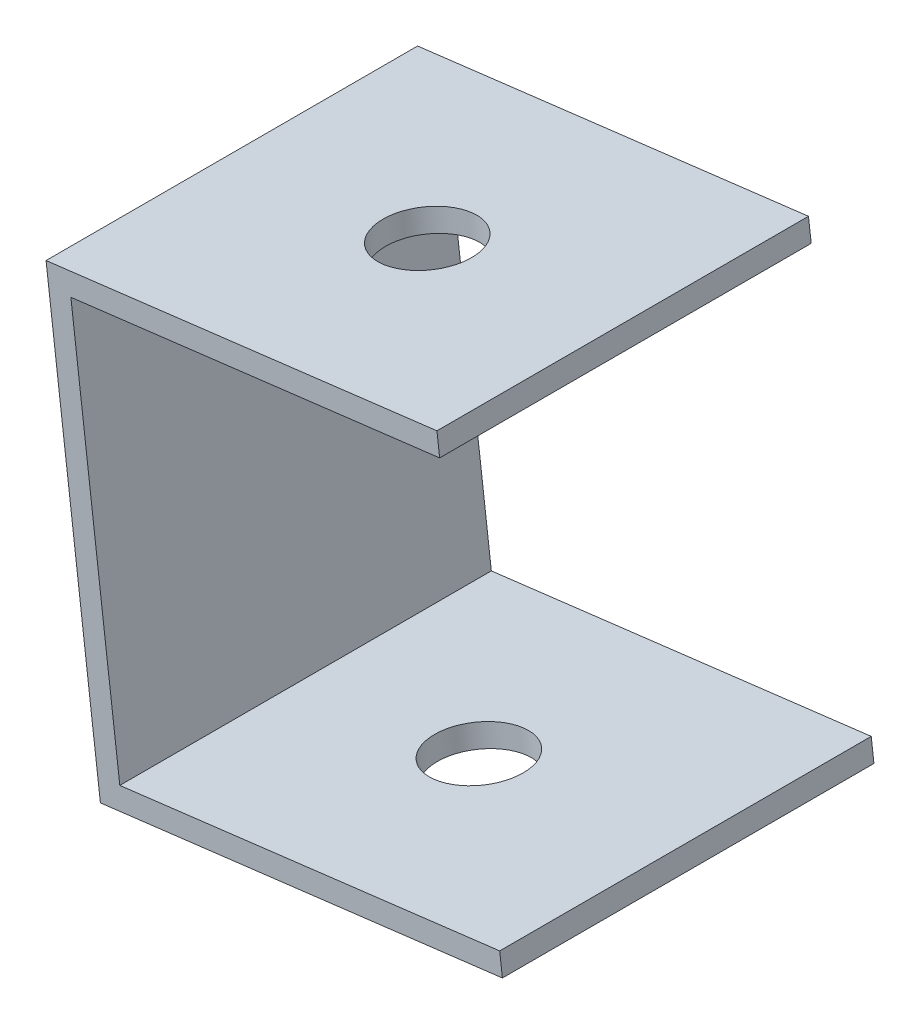
ISO-10303-21;
HEADER;
FILE_DESCRIPTION(('STEP AP214'),'2;1');
FILE_NAME('part.step','',(''),(''),'','','');
FILE_SCHEMA(('AUTOMOTIVE_DESIGN { 1 0 10303 214 1 1 1 1 }'));
ENDSEC;
DATA;
#1=APPLICATION_CONTEXT('core data for automotive mechanical design processes');
#2=APPLICATION_PROTOCOL_DEFINITION('international standard','automotive_design',2000,#1);
#3=PRODUCT_CONTEXT('',#1,'mechanical');
#4=PRODUCT('Part','Part','',(#3));
#5=PRODUCT_RELATED_PRODUCT_CATEGORY('part','',(#4));
#6=PRODUCT_DEFINITION_FORMATION('','',#4);
#7=PRODUCT_DEFINITION_CONTEXT('part definition',#1,'design');
#8=PRODUCT_DEFINITION('design','',#6,#7);
#9=PRODUCT_DEFINITION_SHAPE('','',#8);
#10=(LENGTH_UNIT() NAMED_UNIT(*) SI_UNIT(.MILLI.,.METRE.));
#11=(NAMED_UNIT(*) PLANE_ANGLE_UNIT() SI_UNIT($,.RADIAN.));
#12=(NAMED_UNIT(*) SI_UNIT($,.STERADIAN.) SOLID_ANGLE_UNIT());
#13=UNCERTAINTY_MEASURE_WITH_UNIT(LENGTH_MEASURE(1.E-05),#10,'distance_accuracy_value','');
#14=(GEOMETRIC_REPRESENTATION_CONTEXT(3) GLOBAL_UNCERTAINTY_ASSIGNED_CONTEXT((#13)) GLOBAL_UNIT_ASSIGNED_CONTEXT((#10,
#11,#12)) REPRESENTATION_CONTEXT('',''));
#15=CARTESIAN_POINT('',(0.,0.,0.));
#16=DIRECTION('',(0.,0.,1.));
#17=DIRECTION('',(1.,0.,0.));
#18=AXIS2_PLACEMENT_3D('',#15,#16,#17);
#19=CARTESIAN_POINT('',(54.1021961274049,6.64291439538608,50.));
#20=DIRECTION('',(-0.121869343405145,0.992546151641323,0.));
#21=DIRECTION('',(-0.992546151641323,-0.121869343405145,0.));
#22=AXIS2_PLACEMENT_3D('',#19,#20,#21);
#23=PLANE('',#22);
#24=CARTESIAN_POINT('',(26.3024730184951,3.22953760023633,25.));
#25=DIRECTION('',(-0.121869343405145,0.992546151641323,0.));
#26=DIRECTION('',(-0.992546151641323,-0.121869343405145,0.));
#27=AXIS2_PLACEMENT_3D('',#24,#25,#26);
#28=CIRCLE('',#27,6.00000000000001);
#29=CARTESIAN_POINT('',(20.3471961086471,2.49832153980547,25.));
#30=VERTEX_POINT('',#29);
#31=EDGE_CURVE('E220',#30,#30,#28,.F.);
#32=ORIENTED_EDGE('',*,*,#31,.F.);
#33=EDGE_LOOP('',(#32));
#34=FACE_BOUND('',#33,.T.);
#35=DIRECTION('',(0.992546151641322,0.121869343405145,0.));
#36=VECTOR('',#35,1.);
#37=CARTESIAN_POINT('',(54.1021961274049,6.64291439538608,0.));
#38=LINE('',#37,#36);
#39=CARTESIAN_POINT('',(0.,0.,0.));
#40=VERTEX_POINT('',#39);
#41=CARTESIAN_POINT('',(54.1021961274049,6.64291439538608,0.));
#42=VERTEX_POINT('',#41);
#43=EDGE_CURVE('E146',#40,#42,#38,.T.);
#44=ORIENTED_EDGE('',*,*,#43,.T.);
#45=DIRECTION('',(0.,0.,-1.));
#46=VECTOR('',#45,1.);
#47=CARTESIAN_POINT('',(54.1021961274049,6.64291439538608,50.));
#48=LINE('',#47,#46);
#49=CARTESIAN_POINT('',(54.1021961274049,6.64291439538608,50.));
#50=VERTEX_POINT('',#49);
#51=EDGE_CURVE('E11',#50,#42,#48,.T.);
#52=ORIENTED_EDGE('',*,*,#51,.F.);
#53=DIRECTION('',(0.992546151641322,0.121869343405145,0.));
#54=VECTOR('',#53,1.);
#55=CARTESIAN_POINT('',(54.1021961274049,6.64291439538608,50.));
#56=LINE('',#55,#54);
#57=CARTESIAN_POINT('',(0.,0.,50.));
#58=VERTEX_POINT('',#57);
#59=EDGE_CURVE('E169',#58,#50,#56,.T.);
#60=ORIENTED_EDGE('',*,*,#59,.F.);
#61=DIRECTION('',(0.,0.,-1.));
#62=VECTOR('',#61,1.);
#63=CARTESIAN_POINT('',(0.,0.,50.));
#64=LINE('',#63,#62);
#65=EDGE_CURVE('E142',#58,#40,#64,.T.);
#66=ORIENTED_EDGE('',*,*,#65,.T.);
#67=EDGE_LOOP('',(#44,#52,#60,#66));
#68=FACE_BOUND('',#67,.T.);
#69=ADVANCED_FACE('F45',(#34,#68),#23,.F.);
#70=CARTESIAN_POINT('',(53.7365880971895,9.62055285031005,50.));
#71=DIRECTION('',(-0.992546151641322,-0.121869343405146,0.));
#72=DIRECTION('',(0.121869343405146,-0.992546151641322,0.));
#73=AXIS2_PLACEMENT_3D('',#70,#71,#72);
#74=PLANE('',#73);
#75=DIRECTION('',(-0.121869343405145,0.992546151641322,0.));
#76=VECTOR('',#75,1.);
#77=CARTESIAN_POINT('',(53.7365880971895,9.62055285031005,0.));
#78=LINE('',#77,#76);
#79=CARTESIAN_POINT('',(53.7365880971895,9.62055285031005,0.));
#80=VERTEX_POINT('',#79);
#81=EDGE_CURVE('E150',#42,#80,#78,.T.);
#82=ORIENTED_EDGE('',*,*,#81,.T.);
#83=DIRECTION('',(0.,0.,-1.));
#84=VECTOR('',#83,1.);
#85=CARTESIAN_POINT('',(53.7365880971895,9.62055285031005,50.));
#86=LINE('',#85,#84);
#87=CARTESIAN_POINT('',(53.7365880971895,9.62055285031005,50.));
#88=VERTEX_POINT('',#87);
#89=EDGE_CURVE('E54',#88,#80,#86,.T.);
#90=ORIENTED_EDGE('',*,*,#89,.F.);
#91=DIRECTION('',(-0.121869343405145,0.992546151641322,0.));
#92=VECTOR('',#91,1.);
#93=CARTESIAN_POINT('',(53.7365880971895,9.62055285031005,50.));
#94=LINE('',#93,#92);
#95=EDGE_CURVE('E105',#50,#88,#94,.T.);
#96=ORIENTED_EDGE('',*,*,#95,.F.);
#97=ORIENTED_EDGE('',*,*,#51,.T.);
#98=EDGE_LOOP('',(#82,#90,#96,#97));
#99=FACE_BOUND('',#98,.T.);
#100=ADVANCED_FACE('F244',(#99),#74,.F.);
#101=CARTESIAN_POINT('',(2.61203042470855,3.34324648513938,50.));
#102=DIRECTION('',(0.121869343405145,-0.992546151641322,0.));
#103=DIRECTION('',(0.992546151641322,0.121869343405145,0.));
#104=AXIS2_PLACEMENT_3D('',#101,#102,#103);
#105=PLANE('',#104);
#106=CARTESIAN_POINT('',(25.9368649882796,6.20717605516029,25.));
#107=DIRECTION('',(0.121869343405145,-0.992546151641322,0.));
#108=DIRECTION('',(0.992546151641322,0.121869343405145,0.));
#109=AXIS2_PLACEMENT_3D('',#106,#107,#108);
#110=CIRCLE('',#109,6.00000000000001);
#111=CARTESIAN_POINT('',(31.8921418981276,6.93839211559116,25.));
#112=VERTEX_POINT('',#111);
#113=EDGE_CURVE('E151',#112,#112,#110,.T.);
#114=ORIENTED_EDGE('',*,*,#113,.T.);
#115=EDGE_LOOP('',(#114));
#116=FACE_BOUND('',#115,.T.);
#117=DIRECTION('',(-0.992546151641322,-0.121869343405145,0.));
#118=VECTOR('',#117,1.);
#119=CARTESIAN_POINT('',(2.61203042470855,3.34324648513938,0.));
#120=LINE('',#119,#118);
#121=CARTESIAN_POINT('',(2.61203042470855,3.34324648513938,0.));
#122=VERTEX_POINT('',#121);
#123=EDGE_CURVE('E154',#80,#122,#120,.T.);
#124=ORIENTED_EDGE('',*,*,#123,.T.);
#125=DIRECTION('',(0.,0.,-1.));
#126=VECTOR('',#125,1.);
#127=CARTESIAN_POINT('',(2.61203042470855,3.34324648513938,50.));
#128=LINE('',#127,#126);
#129=CARTESIAN_POINT('',(2.61203042470855,3.34324648513938,50.));
#130=VERTEX_POINT('',#129);
#131=EDGE_CURVE('E180',#130,#122,#128,.T.);
#132=ORIENTED_EDGE('',*,*,#131,.F.);
#133=DIRECTION('',(-0.992546151641322,-0.121869343405145,0.));
#134=VECTOR('',#133,1.);
#135=CARTESIAN_POINT('',(2.61203042470855,3.34324648513938,50.));
#136=LINE('',#135,#134);
#137=EDGE_CURVE('E190',#88,#130,#136,.T.);
#138=ORIENTED_EDGE('',*,*,#137,.F.);
#139=ORIENTED_EDGE('',*,*,#89,.T.);
#140=EDGE_LOOP('',(#124,#132,#138,#139));
#141=FACE_BOUND('',#140,.T.);
#142=ADVANCED_FACE('F188',(#116,#141),#105,.F.);
#143=CARTESIAN_POINT('',(-3.96891411916928,56.9407386737708,50.));
#144=DIRECTION('',(-0.992546151641322,-0.121869343405145,0.));
#145=DIRECTION('',(0.121869343405145,-0.992546151641322,0.));
#146=AXIS2_PLACEMENT_3D('',#143,#144,#145);
#147=PLANE('',#146);
#148=DIRECTION('',(-0.121869343405145,0.992546151641322,0.));
#149=VECTOR('',#148,1.);
#150=CARTESIAN_POINT('',(-3.96891411916928,56.9407386737708,0.));
#151=LINE('',#150,#149);
#152=CARTESIAN_POINT('',(-3.96891411916928,56.9407386737708,0.));
#153=VERTEX_POINT('',#152);
#154=EDGE_CURVE('E157',#122,#153,#151,.T.);
#155=ORIENTED_EDGE('',*,*,#154,.T.);
#156=DIRECTION('',(0.,0.,-1.));
#157=VECTOR('',#156,1.);
#158=CARTESIAN_POINT('',(-3.96891411916928,56.9407386737708,50.));
#159=LINE('',#158,#157);
#160=CARTESIAN_POINT('',(-3.96891411916928,56.9407386737708,50.));
#161=VERTEX_POINT('',#160);
#162=EDGE_CURVE('E176',#161,#153,#159,.T.);
#163=ORIENTED_EDGE('',*,*,#162,.F.);
#164=DIRECTION('',(-0.121869343405145,0.992546151641322,0.));
#165=VECTOR('',#164,1.);
#166=CARTESIAN_POINT('',(-3.96891411916928,56.9407386737708,50.));
#167=LINE('',#166,#165);
#168=EDGE_CURVE('E203',#130,#161,#167,.T.);
#169=ORIENTED_EDGE('',*,*,#168,.F.);
#170=ORIENTED_EDGE('',*,*,#131,.T.);
#171=EDGE_LOOP('',(#155,#163,#169,#170));
#172=FACE_BOUND('',#171,.T.);
#173=ADVANCED_FACE('F198',(#172),#147,.F.);
#174=CARTESIAN_POINT('',(45.6583934628968,63.034205844028,50.));
#175=DIRECTION('',(-0.121869343405145,0.992546151641322,0.));
#176=DIRECTION('',(-0.992546151641322,-0.121869343405145,0.));
#177=AXIS2_PLACEMENT_3D('',#174,#175,#176);
#178=PLANE('',#177);
#179=CARTESIAN_POINT('',(19.3559204444018,59.8046682437917,25.));
#180=DIRECTION('',(-0.121869343405145,0.992546151641322,0.));
#181=DIRECTION('',(-0.992546151641322,-0.121869343405145,0.));
#182=AXIS2_PLACEMENT_3D('',#179,#180,#181);
#183=CIRCLE('',#182,6.00000000000001);
#184=CARTESIAN_POINT('',(13.4006435345539,59.0734521833608,25.));
#185=VERTEX_POINT('',#184);
#186=EDGE_CURVE('E216',#185,#185,#183,.T.);
#187=ORIENTED_EDGE('',*,*,#186,.T.);
#188=EDGE_LOOP('',(#187));
#189=FACE_BOUND('',#188,.T.);
#190=DIRECTION('',(0.992546151641322,0.121869343405145,0.));
#191=VECTOR('',#190,1.);
#192=CARTESIAN_POINT('',(45.6583934628968,63.034205844028,0.));
#193=LINE('',#192,#191);
#194=CARTESIAN_POINT('',(45.6583934628968,63.034205844028,0.));
#195=VERTEX_POINT('',#194);
#196=EDGE_CURVE('E160',#153,#195,#193,.T.);
#197=ORIENTED_EDGE('',*,*,#196,.T.);
#198=DIRECTION('',(0.,0.,-1.));
#199=VECTOR('',#198,1.);
#200=CARTESIAN_POINT('',(45.6583934628968,63.034205844028,50.));
#201=LINE('',#200,#199);
#202=CARTESIAN_POINT('',(45.6583934628968,63.034205844028,50.));
#203=VERTEX_POINT('',#202);
#204=EDGE_CURVE('E135',#203,#195,#201,.T.);
#205=ORIENTED_EDGE('',*,*,#204,.F.);
#206=DIRECTION('',(0.992546151641322,0.121869343405145,0.));
#207=VECTOR('',#206,1.);
#208=CARTESIAN_POINT('',(45.6583934628968,63.034205844028,50.));
#209=LINE('',#208,#207);
#210=EDGE_CURVE('E124',#161,#203,#209,.T.);
#211=ORIENTED_EDGE('',*,*,#210,.F.);
#212=ORIENTED_EDGE('',*,*,#162,.T.);
#213=EDGE_LOOP('',(#197,#205,#211,#212));
#214=FACE_BOUND('',#213,.T.);
#215=ADVANCED_FACE('F201',(#189,#214),#178,.F.);
#216=CARTESIAN_POINT('',(45.2927854326814,66.011844298952,50.));
#217=DIRECTION('',(-0.992546151641322,-0.121869343405144,0.));
#218=DIRECTION('',(0.121869343405144,-0.992546151641322,0.));
#219=AXIS2_PLACEMENT_3D('',#216,#217,#218);
#220=PLANE('',#219);
#221=DIRECTION('',(-0.121869343405144,0.992546151641322,0.));
#222=VECTOR('',#221,1.);
#223=CARTESIAN_POINT('',(45.2927854326814,66.011844298952,0.));
#224=LINE('',#223,#222);
#225=CARTESIAN_POINT('',(45.2927854326814,66.011844298952,0.));
#226=VERTEX_POINT('',#225);
#227=EDGE_CURVE('E133',#195,#226,#224,.T.);
#228=ORIENTED_EDGE('',*,*,#227,.T.);
#229=DIRECTION('',(0.,0.,-1.));
#230=VECTOR('',#229,1.);
#231=CARTESIAN_POINT('',(45.2927854326814,66.011844298952,50.));
#232=LINE('',#231,#230);
#233=CARTESIAN_POINT('',(45.2927854326814,66.011844298952,50.));
#234=VERTEX_POINT('',#233);
#235=EDGE_CURVE('E130',#234,#226,#232,.T.);
#236=ORIENTED_EDGE('',*,*,#235,.F.);
#237=DIRECTION('',(-0.121869343405144,0.992546151641322,0.));
#238=VECTOR('',#237,1.);
#239=CARTESIAN_POINT('',(45.2927854326814,66.011844298952,50.));
#240=LINE('',#239,#238);
#241=EDGE_CURVE('E118',#203,#234,#240,.T.);
#242=ORIENTED_EDGE('',*,*,#241,.F.);
#243=ORIENTED_EDGE('',*,*,#204,.T.);
#244=EDGE_LOOP('',(#228,#236,#242,#243));
#245=FACE_BOUND('',#244,.T.);
#246=ADVANCED_FACE('F131',(#245),#220,.F.);
#247=CARTESIAN_POINT('',(-7.31216060430867,59.5527690984793,50.));
#248=DIRECTION('',(0.121869343405145,-0.992546151641322,0.));
#249=DIRECTION('',(0.992546151641322,0.121869343405145,0.));
#250=AXIS2_PLACEMENT_3D('',#247,#248,#249);
#251=PLANE('',#250);
#252=CARTESIAN_POINT('',(18.9903124141864,62.7823066987156,25.));
#253=DIRECTION('',(-0.121869343405145,0.992546151641322,0.));
#254=DIRECTION('',(-0.992546151641322,-0.121869343405145,0.));
#255=AXIS2_PLACEMENT_3D('',#252,#253,#254);
#256=CIRCLE('',#255,6.00000000000001);
#257=CARTESIAN_POINT('',(13.0350355043384,62.0510906382848,25.));
#258=VERTEX_POINT('',#257);
#259=EDGE_CURVE('E224',#258,#258,#256,.T.);
#260=ORIENTED_EDGE('',*,*,#259,.F.);
#261=EDGE_LOOP('',(#260));
#262=FACE_BOUND('',#261,.T.);
#263=DIRECTION('',(-0.992546151641322,-0.121869343405145,0.));
#264=VECTOR('',#263,1.);
#265=CARTESIAN_POINT('',(-7.31216060430867,59.5527690984793,0.));
#266=LINE('',#265,#264);
#267=CARTESIAN_POINT('',(-7.31216060430867,59.5527690984793,0.));
#268=VERTEX_POINT('',#267);
#269=EDGE_CURVE('E91',#226,#268,#266,.T.);
#270=ORIENTED_EDGE('',*,*,#269,.T.);
#271=DIRECTION('',(0.,0.,-1.));
#272=VECTOR('',#271,1.);
#273=CARTESIAN_POINT('',(-7.31216060430867,59.5527690984793,50.));
#274=LINE('',#273,#272);
#275=CARTESIAN_POINT('',(-7.31216060430867,59.5527690984793,50.));
#276=VERTEX_POINT('',#275);
#277=EDGE_CURVE('E136',#276,#268,#274,.T.);
#278=ORIENTED_EDGE('',*,*,#277,.F.);
#279=DIRECTION('',(-0.992546151641322,-0.121869343405145,0.));
#280=VECTOR('',#279,1.);
#281=CARTESIAN_POINT('',(-7.31216060430867,59.5527690984793,50.));
#282=LINE('',#281,#280);
#283=EDGE_CURVE('E122',#234,#276,#282,.T.);
#284=ORIENTED_EDGE('',*,*,#283,.F.);
#285=ORIENTED_EDGE('',*,*,#235,.T.);
#286=EDGE_LOOP('',(#270,#278,#284,#285));
#287=FACE_BOUND('',#286,.T.);
#288=ADVANCED_FACE('F138',(#262,#287),#251,.F.);
#289=CARTESIAN_POINT('',(0.,0.,50.));
#290=DIRECTION('',(0.992546151641323,0.121869343405145,0.));
#291=DIRECTION('',(-0.121869343405145,0.992546151641323,0.));
#292=AXIS2_PLACEMENT_3D('',#289,#290,#291);
#293=PLANE('',#292);
#294=DIRECTION('',(0.121869343405145,-0.992546151641322,0.));
#295=VECTOR('',#294,1.);
#296=CARTESIAN_POINT('',(0.,0.,0.));
#297=LINE('',#296,#295);
#298=EDGE_CURVE('E97',#268,#40,#297,.T.);
#299=ORIENTED_EDGE('',*,*,#298,.T.);
#300=ORIENTED_EDGE('',*,*,#65,.F.);
#301=DIRECTION('',(0.121869343405145,-0.992546151641322,0.));
#302=VECTOR('',#301,1.);
#303=CARTESIAN_POINT('',(0.,0.,50.));
#304=LINE('',#303,#302);
#305=EDGE_CURVE('E62',#276,#58,#304,.T.);
#306=ORIENTED_EDGE('',*,*,#305,.F.);
#307=ORIENTED_EDGE('',*,*,#277,.T.);
#308=EDGE_LOOP('',(#299,#300,#306,#307));
#309=FACE_BOUND('',#308,.T.);
#310=ADVANCED_FACE('F233',(#309),#293,.F.);
#311=CARTESIAN_POINT('',(0.,0.,50.));
#312=DIRECTION('',(0.,0.,-1.));
#313=DIRECTION('',(-1.,0.,0.));
#314=AXIS2_PLACEMENT_3D('',#311,#312,#313);
#315=PLANE('',#314);
#316=ORIENTED_EDGE('',*,*,#59,.T.);
#317=ORIENTED_EDGE('',*,*,#95,.T.);
#318=ORIENTED_EDGE('',*,*,#137,.T.);
#319=ORIENTED_EDGE('',*,*,#168,.T.);
#320=ORIENTED_EDGE('',*,*,#210,.T.);
#321=ORIENTED_EDGE('',*,*,#241,.T.);
#322=ORIENTED_EDGE('',*,*,#283,.T.);
#323=ORIENTED_EDGE('',*,*,#305,.T.);
#324=EDGE_LOOP('',(#316,#317,#318,#319,#320,#321,#322,#323));
#325=FACE_BOUND('',#324,.T.);
#326=ADVANCED_FACE('F120',(#325),#315,.F.);
#327=CARTESIAN_POINT('',(0.,0.,0.));
#328=DIRECTION('',(0.,0.,-1.));
#329=DIRECTION('',(-1.,0.,0.));
#330=AXIS2_PLACEMENT_3D('',#327,#328,#329);
#331=PLANE('',#330);
#332=ORIENTED_EDGE('',*,*,#43,.F.);
#333=ORIENTED_EDGE('',*,*,#298,.F.);
#334=ORIENTED_EDGE('',*,*,#269,.F.);
#335=ORIENTED_EDGE('',*,*,#227,.F.);
#336=ORIENTED_EDGE('',*,*,#196,.F.);
#337=ORIENTED_EDGE('',*,*,#154,.F.);
#338=ORIENTED_EDGE('',*,*,#123,.F.);
#339=ORIENTED_EDGE('',*,*,#81,.F.);
#340=EDGE_LOOP('',(#332,#333,#334,#335,#336,#337,#338,#339));
#341=FACE_BOUND('',#340,.T.);
#342=ADVANCED_FACE('F194',(#341),#331,.T.);
#343=CARTESIAN_POINT('',(28.3706643578678,-13.6145291469523,25.));
#344=DIRECTION('',(-0.121869343405145,0.992546151641322,0.));
#345=DIRECTION('',(-0.992546151641322,-0.121869343405145,0.));
#346=AXIS2_PLACEMENT_3D('',#343,#344,#345);
#347=CYLINDRICAL_SURFACE('',#346,6.00000000000001);
#348=ORIENTED_EDGE('',*,*,#259,.T.);
#349=EDGE_LOOP('',(#348));
#350=FACE_BOUND('',#349,.T.);
#351=ORIENTED_EDGE('',*,*,#186,.F.);
#352=EDGE_LOOP('',(#351));
#353=FACE_BOUND('',#352,.T.);
#354=ADVANCED_FACE('F229',(#350,#353),#347,.F.);
#355=ORIENTED_EDGE('',*,*,#31,.T.);
#356=EDGE_LOOP('',(#355));
#357=FACE_BOUND('',#356,.T.);
#358=ORIENTED_EDGE('',*,*,#113,.F.);
#359=EDGE_LOOP('',(#358));
#360=FACE_BOUND('',#359,.T.);
#361=ADVANCED_FACE('F256',(#357,#360),#347,.F.);
#362=CLOSED_SHELL('',(#69,#100,#142,#173,#215,#246,#288,#310,#326,#342,#354,#361));
#363=MANIFOLD_SOLID_BREP('B2',#362);
#364=ADVANCED_BREP_SHAPE_REPRESENTATION('',(#18,#363),#14);
#365=SHAPE_DEFINITION_REPRESENTATION(#9,#364);
ENDSEC;
END-ISO-10303-21;
